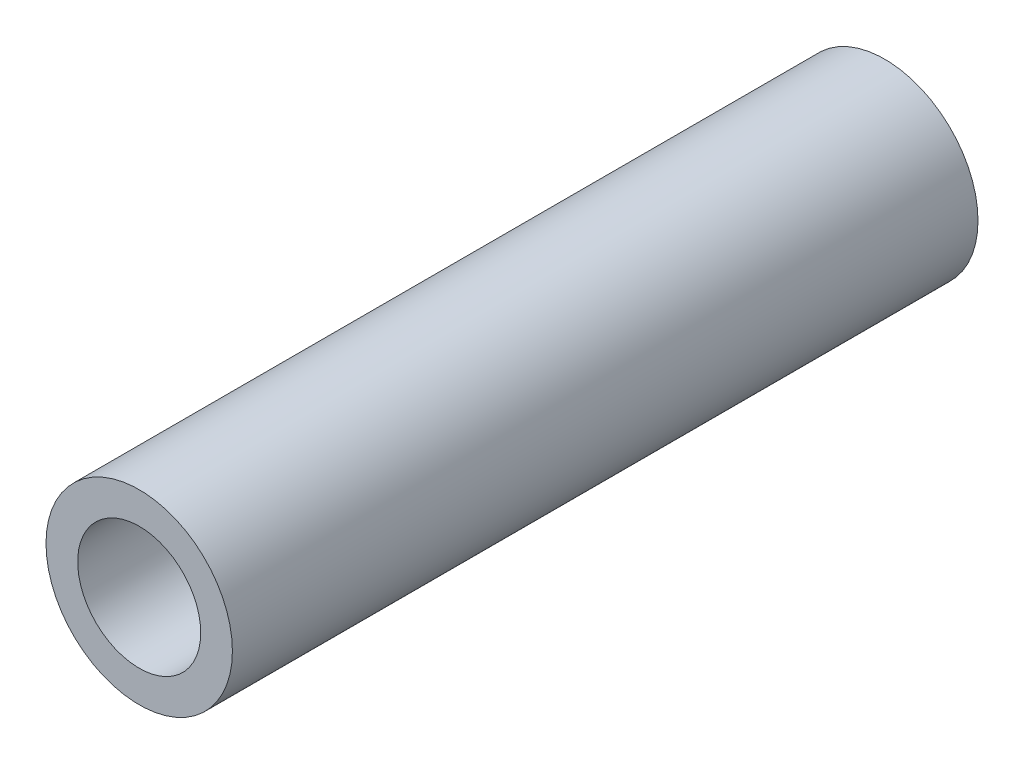
ISO-10303-21;
HEADER;
FILE_DESCRIPTION(('STEP AP214'),'2;1');
FILE_NAME('part.step','',(''),(''),'','','');
FILE_SCHEMA(('AUTOMOTIVE_DESIGN { 1 0 10303 214 1 1 1 1 }'));
ENDSEC;
DATA;
#1=APPLICATION_CONTEXT('core data for automotive mechanical design processes');
#2=APPLICATION_PROTOCOL_DEFINITION('international standard','automotive_design',2000,#1);
#3=PRODUCT_CONTEXT('',#1,'mechanical');
#4=PRODUCT('Part','Part','',(#3));
#5=PRODUCT_RELATED_PRODUCT_CATEGORY('part','',(#4));
#6=PRODUCT_DEFINITION_FORMATION('','',#4);
#7=PRODUCT_DEFINITION_CONTEXT('part definition',#1,'design');
#8=PRODUCT_DEFINITION('design','',#6,#7);
#9=PRODUCT_DEFINITION_SHAPE('','',#8);
#10=(LENGTH_UNIT() NAMED_UNIT(*) SI_UNIT(.MILLI.,.METRE.));
#11=(NAMED_UNIT(*) PLANE_ANGLE_UNIT() SI_UNIT($,.RADIAN.));
#12=(NAMED_UNIT(*) SI_UNIT($,.STERADIAN.) SOLID_ANGLE_UNIT());
#13=UNCERTAINTY_MEASURE_WITH_UNIT(LENGTH_MEASURE(1.E-05),#10,'distance_accuracy_value','');
#14=(GEOMETRIC_REPRESENTATION_CONTEXT(3) GLOBAL_UNCERTAINTY_ASSIGNED_CONTEXT((#13)) GLOBAL_UNIT_ASSIGNED_CONTEXT((#10,
#11,#12)) REPRESENTATION_CONTEXT('',''));
#15=CARTESIAN_POINT('',(0.,0.,0.));
#16=DIRECTION('',(0.,0.,1.));
#17=DIRECTION('',(1.,0.,0.));
#18=AXIS2_PLACEMENT_3D('',#15,#16,#17);
#19=CARTESIAN_POINT('',(0.,0.,12.7));
#20=DIRECTION('',(0.,0.,1.));
#21=DIRECTION('',(1.,0.,0.));
#22=AXIS2_PLACEMENT_3D('',#19,#20,#21);
#23=PLANE('',#22);
#24=CARTESIAN_POINT('',(0.,0.,12.7));
#25=DIRECTION('',(0.,0.,1.));
#26=DIRECTION('',(1.,0.,0.));
#27=AXIS2_PLACEMENT_3D('',#24,#25,#26);
#28=CIRCLE('',#27,3.175);
#29=CARTESIAN_POINT('',(3.175,0.,12.7));
#30=VERTEX_POINT('',#29);
#31=EDGE_CURVE('E10',#30,#30,#28,.T.);
#32=ORIENTED_EDGE('',*,*,#31,.T.);
#33=EDGE_LOOP('',(#32));
#34=FACE_BOUND('',#33,.T.);
#35=CARTESIAN_POINT('',(0.,0.,12.7));
#36=DIRECTION('',(0.,0.,1.));
#37=DIRECTION('',(1.,0.,0.));
#38=AXIS2_PLACEMENT_3D('',#35,#36,#37);
#39=CIRCLE('',#38,2.0955);
#40=CARTESIAN_POINT('',(2.0955,0.,12.7));
#41=VERTEX_POINT('',#40);
#42=EDGE_CURVE('E49',#41,#41,#39,.T.);
#43=ORIENTED_EDGE('',*,*,#42,.F.);
#44=EDGE_LOOP('',(#43));
#45=FACE_BOUND('',#44,.T.);
#46=ADVANCED_FACE('F36',(#34,#45),#23,.T.);
#47=CARTESIAN_POINT('',(0.,0.,-12.7));
#48=DIRECTION('',(0.,0.,1.));
#49=DIRECTION('',(1.,0.,0.));
#50=AXIS2_PLACEMENT_3D('',#47,#48,#49);
#51=PLANE('',#50);
#52=CARTESIAN_POINT('',(0.,0.,-12.7));
#53=DIRECTION('',(0.,0.,1.));
#54=DIRECTION('',(1.,0.,0.));
#55=AXIS2_PLACEMENT_3D('',#52,#53,#54);
#56=CIRCLE('',#55,3.175);
#57=CARTESIAN_POINT('',(3.175,0.,-12.7));
#58=VERTEX_POINT('',#57);
#59=EDGE_CURVE('E40',#58,#58,#56,.T.);
#60=ORIENTED_EDGE('',*,*,#59,.F.);
#61=EDGE_LOOP('',(#60));
#62=FACE_BOUND('',#61,.T.);
#63=CARTESIAN_POINT('',(0.,0.,-12.7));
#64=DIRECTION('',(0.,0.,1.));
#65=DIRECTION('',(1.,0.,0.));
#66=AXIS2_PLACEMENT_3D('',#63,#64,#65);
#67=CIRCLE('',#66,2.0955);
#68=CARTESIAN_POINT('',(2.0955,0.,-12.7));
#69=VERTEX_POINT('',#68);
#70=EDGE_CURVE('E51',#69,#69,#67,.T.);
#71=ORIENTED_EDGE('',*,*,#70,.T.);
#72=EDGE_LOOP('',(#71));
#73=FACE_BOUND('',#72,.T.);
#74=ADVANCED_FACE('F62',(#62,#73),#51,.F.);
#75=CARTESIAN_POINT('',(0.,0.,12.7));
#76=DIRECTION('',(0.,0.,-1.));
#77=DIRECTION('',(-1.,0.,0.));
#78=AXIS2_PLACEMENT_3D('',#75,#76,#77);
#79=CYLINDRICAL_SURFACE('',#78,3.175);
#80=ORIENTED_EDGE('',*,*,#31,.F.);
#81=EDGE_LOOP('',(#80));
#82=FACE_BOUND('',#81,.T.);
#83=ORIENTED_EDGE('',*,*,#59,.T.);
#84=EDGE_LOOP('',(#83));
#85=FACE_BOUND('',#84,.T.);
#86=ADVANCED_FACE('F38',(#82,#85),#79,.T.);
#87=CARTESIAN_POINT('',(0.,0.,12.7));
#88=DIRECTION('',(0.,0.,-1.));
#89=DIRECTION('',(-1.,0.,0.));
#90=AXIS2_PLACEMENT_3D('',#87,#88,#89);
#91=CYLINDRICAL_SURFACE('',#90,2.0955);
#92=ORIENTED_EDGE('',*,*,#42,.T.);
#93=EDGE_LOOP('',(#92));
#94=FACE_BOUND('',#93,.T.);
#95=ORIENTED_EDGE('',*,*,#70,.F.);
#96=EDGE_LOOP('',(#95));
#97=FACE_BOUND('',#96,.T.);
#98=ADVANCED_FACE('F58',(#94,#97),#91,.F.);
#99=CLOSED_SHELL('',(#46,#74,#86,#98));
#100=MANIFOLD_SOLID_BREP('B2',#99);
#101=ADVANCED_BREP_SHAPE_REPRESENTATION('',(#18,#100),#14);
#102=SHAPE_DEFINITION_REPRESENTATION(#9,#101);
ENDSEC;
END-ISO-10303-21;
